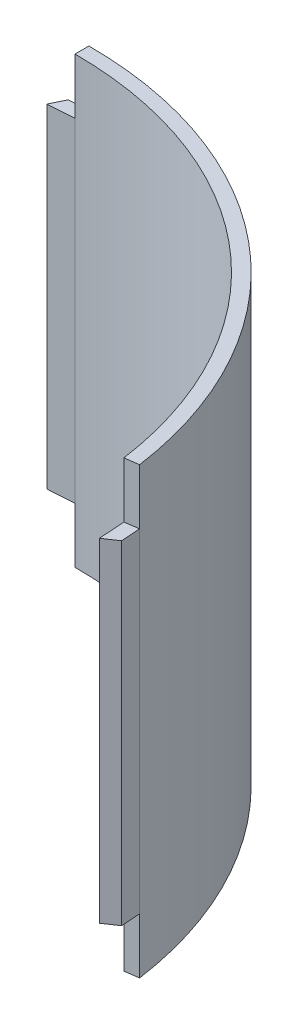
ISO-10303-21;
HEADER;
FILE_DESCRIPTION(('STEP AP214'),'2;1');
FILE_NAME('part.step','',(''),(''),'','','');
FILE_SCHEMA(('AUTOMOTIVE_DESIGN { 1 0 10303 214 1 1 1 1 }'));
ENDSEC;
DATA;
#1=APPLICATION_CONTEXT('core data for automotive mechanical design processes');
#2=APPLICATION_PROTOCOL_DEFINITION('international standard','automotive_design',2000,#1);
#3=PRODUCT_CONTEXT('',#1,'mechanical');
#4=PRODUCT('Part','Part','',(#3));
#5=PRODUCT_RELATED_PRODUCT_CATEGORY('part','',(#4));
#6=PRODUCT_DEFINITION_FORMATION('','',#4);
#7=PRODUCT_DEFINITION_CONTEXT('part definition',#1,'design');
#8=PRODUCT_DEFINITION('design','',#6,#7);
#9=PRODUCT_DEFINITION_SHAPE('','',#8);
#10=(LENGTH_UNIT() NAMED_UNIT(*) SI_UNIT(.MILLI.,.METRE.));
#11=(NAMED_UNIT(*) PLANE_ANGLE_UNIT() SI_UNIT($,.RADIAN.));
#12=(NAMED_UNIT(*) SI_UNIT($,.STERADIAN.) SOLID_ANGLE_UNIT());
#13=UNCERTAINTY_MEASURE_WITH_UNIT(LENGTH_MEASURE(1.E-05),#10,'distance_accuracy_value','');
#14=(GEOMETRIC_REPRESENTATION_CONTEXT(3) GLOBAL_UNCERTAINTY_ASSIGNED_CONTEXT((#13)) GLOBAL_UNIT_ASSIGNED_CONTEXT((#10,
#11,#12)) REPRESENTATION_CONTEXT('',''));
#15=CARTESIAN_POINT('',(0.,0.,0.));
#16=DIRECTION('',(0.,0.,1.));
#17=DIRECTION('',(1.,0.,0.));
#18=AXIS2_PLACEMENT_3D('',#15,#16,#17);
#19=CARTESIAN_POINT('',(0.,800.,-705.));
#20=DIRECTION('',(1.,0.,0.));
#21=DIRECTION('',(0.,0.,-1.));
#22=AXIS2_PLACEMENT_3D('',#19,#20,#21);
#23=PLANE('',#22);
#24=DIRECTION('',(0.,0.,-1.));
#25=VECTOR('',#24,1.);
#26=CARTESIAN_POINT('',(-1.67579190573702E-13,700.,-1.45674367899697E-13));
#27=LINE('',#26,#25);
#28=CARTESIAN_POINT('',(0.,700.,-680.));
#29=VERTEX_POINT('',#28);
#30=CARTESIAN_POINT('',(0.,700.,-705.));
#31=VERTEX_POINT('',#30);
#32=EDGE_CURVE('E144',#29,#31,#27,.T.);
#33=ORIENTED_EDGE('',*,*,#32,.F.);
#34=DIRECTION('',(0.,-1.,0.));
#35=VECTOR('',#34,1.);
#36=CARTESIAN_POINT('',(0.,800.,-680.));
#37=LINE('',#36,#35);
#38=CARTESIAN_POINT('',(0.,800.,-680.));
#39=VERTEX_POINT('',#38);
#40=EDGE_CURVE('E150',#39,#29,#37,.T.);
#41=ORIENTED_EDGE('',*,*,#40,.F.);
#42=DIRECTION('',(0.,0.,1.));
#43=VECTOR('',#42,1.);
#44=CARTESIAN_POINT('',(0.,800.,-705.));
#45=LINE('',#44,#43);
#46=CARTESIAN_POINT('',(0.,800.,-705.));
#47=VERTEX_POINT('',#46);
#48=EDGE_CURVE('E184',#47,#39,#45,.T.);
#49=ORIENTED_EDGE('',*,*,#48,.F.);
#50=DIRECTION('',(0.,-1.,0.));
#51=VECTOR('',#50,1.);
#52=CARTESIAN_POINT('',(0.,800.,-705.));
#53=LINE('',#52,#51);
#54=EDGE_CURVE('E11',#47,#31,#53,.T.);
#55=ORIENTED_EDGE('',*,*,#54,.T.);
#56=EDGE_LOOP('',(#33,#41,#49,#55));
#57=FACE_BOUND('',#56,.T.);
#58=ADVANCED_FACE('F37',(#57),#23,.F.);
#59=CARTESIAN_POINT('',(698.138988462807,800.,-98.1170361768489));
#60=DIRECTION('',(-0.139173100960069,0.,-0.99026806874157));
#61=DIRECTION('',(-0.99026806874157,0.,0.139173100960069));
#62=AXIS2_PLACEMENT_3D('',#59,#60,#61);
#63=PLANE('',#62);
#64=DIRECTION('',(0.99026806874157,0.,-0.13917310096007));
#65=VECTOR('',#64,1.);
#66=CARTESIAN_POINT('',(0.,700.,0.));
#67=LINE('',#66,#65);
#68=CARTESIAN_POINT('',(673.382286744267,700.,-94.6377086528472));
#69=VERTEX_POINT('',#68);
#70=CARTESIAN_POINT('',(698.138988462806,700.,-98.1170361768489));
#71=VERTEX_POINT('',#70);
#72=EDGE_CURVE('E225',#69,#71,#67,.T.);
#73=ORIENTED_EDGE('',*,*,#72,.T.);
#74=DIRECTION('',(0.,-1.,0.));
#75=VECTOR('',#74,1.);
#76=CARTESIAN_POINT('',(698.138988462807,800.,-98.1170361768489));
#77=LINE('',#76,#75);
#78=CARTESIAN_POINT('',(698.138988462807,800.,-98.1170361768489));
#79=VERTEX_POINT('',#78);
#80=EDGE_CURVE('E164',#79,#71,#77,.T.);
#81=ORIENTED_EDGE('',*,*,#80,.F.);
#82=DIRECTION('',(0.99026806874157,0.,-0.139173100960069));
#83=VECTOR('',#82,1.);
#84=CARTESIAN_POINT('',(698.138988462807,800.,-98.1170361768489));
#85=LINE('',#84,#83);
#86=CARTESIAN_POINT('',(673.382286744267,800.,-94.6377086528472));
#87=VERTEX_POINT('',#86);
#88=EDGE_CURVE('E181',#87,#79,#85,.T.);
#89=ORIENTED_EDGE('',*,*,#88,.F.);
#90=DIRECTION('',(0.,-1.,0.));
#91=VECTOR('',#90,1.);
#92=CARTESIAN_POINT('',(673.382286744267,800.,-94.6377086528472));
#93=LINE('',#92,#91);
#94=EDGE_CURVE('E159',#87,#69,#93,.T.);
#95=ORIENTED_EDGE('',*,*,#94,.T.);
#96=EDGE_LOOP('',(#73,#81,#89,#95));
#97=FACE_BOUND('',#96,.T.);
#98=ADVANCED_FACE('F264',(#97),#63,.F.);
#99=DIRECTION('',(0.99026806874157,0.,-0.13917310096007));
#100=VECTOR('',#99,1.);
#101=CARTESIAN_POINT('',(0.,100.,0.));
#102=LINE('',#101,#100);
#103=CARTESIAN_POINT('',(673.382286744267,100.,-94.6377086528472));
#104=VERTEX_POINT('',#103);
#105=CARTESIAN_POINT('',(698.138988462806,100.,-98.1170361768489));
#106=VERTEX_POINT('',#105);
#107=EDGE_CURVE('E60',#104,#106,#102,.T.);
#108=ORIENTED_EDGE('',*,*,#107,.F.);
#109=CARTESIAN_POINT('',(673.382286744267,0.,-94.6377086528472));
#110=VERTEX_POINT('',#109);
#111=EDGE_CURVE('E163',#104,#110,#93,.T.);
#112=ORIENTED_EDGE('',*,*,#111,.T.);
#113=DIRECTION('',(0.99026806874157,0.,-0.139173100960069));
#114=VECTOR('',#113,1.);
#115=CARTESIAN_POINT('',(698.138988462807,0.,-98.1170361768489));
#116=LINE('',#115,#114);
#117=CARTESIAN_POINT('',(698.138988462807,0.,-98.1170361768489));
#118=VERTEX_POINT('',#117);
#119=EDGE_CURVE('E168',#110,#118,#116,.T.);
#120=ORIENTED_EDGE('',*,*,#119,.T.);
#121=EDGE_CURVE('E167',#106,#118,#77,.T.);
#122=ORIENTED_EDGE('',*,*,#121,.F.);
#123=EDGE_LOOP('',(#108,#112,#120,#122));
#124=FACE_BOUND('',#123,.T.);
#125=ADVANCED_FACE('F246',(#124),#63,.F.);
#126=CARTESIAN_POINT('',(0.,800.,0.));
#127=DIRECTION('',(0.,-1.,0.));
#128=DIRECTION('',(0.,0.,-1.));
#129=AXIS2_PLACEMENT_3D('',#126,#127,#128);
#130=CYLINDRICAL_SURFACE('',#129,705.);
#131=CARTESIAN_POINT('',(0.,0.,0.));
#132=DIRECTION('',(0.,1.,0.));
#133=DIRECTION('',(0.,0.,-1.));
#134=AXIS2_PLACEMENT_3D('',#131,#132,#133);
#135=CIRCLE('',#134,705.);
#136=CARTESIAN_POINT('',(0.,0.,-705.));
#137=VERTEX_POINT('',#136);
#138=EDGE_CURVE('E177',#118,#137,#135,.T.);
#139=ORIENTED_EDGE('',*,*,#138,.T.);
#140=CARTESIAN_POINT('',(0.,100.,-705.));
#141=VERTEX_POINT('',#140);
#142=EDGE_CURVE('E45',#141,#137,#53,.T.);
#143=ORIENTED_EDGE('',*,*,#142,.F.);
#144=DIRECTION('',(0.,1.,0.));
#145=VECTOR('',#144,1.);
#146=CARTESIAN_POINT('',(2.35922392732846E-13,100.,-705.));
#147=LINE('',#146,#145);
#148=EDGE_CURVE('E204',#141,#31,#147,.T.);
#149=ORIENTED_EDGE('',*,*,#148,.T.);
#150=ORIENTED_EDGE('',*,*,#54,.F.);
#151=CARTESIAN_POINT('',(0.,800.,0.));
#152=DIRECTION('',(0.,1.,0.));
#153=DIRECTION('',(0.,0.,-1.));
#154=AXIS2_PLACEMENT_3D('',#151,#152,#153);
#155=CIRCLE('',#154,705.);
#156=EDGE_CURVE('E171',#79,#47,#155,.T.);
#157=ORIENTED_EDGE('',*,*,#156,.F.);
#158=ORIENTED_EDGE('',*,*,#80,.T.);
#159=DIRECTION('',(0.,1.,0.));
#160=VECTOR('',#159,1.);
#161=CARTESIAN_POINT('',(698.138988462806,100.,-98.1170361768489));
#162=LINE('',#161,#160);
#163=EDGE_CURVE('E180',#106,#71,#162,.T.);
#164=ORIENTED_EDGE('',*,*,#163,.F.);
#165=ORIENTED_EDGE('',*,*,#121,.T.);
#166=EDGE_LOOP('',(#139,#143,#149,#150,#157,#158,#164,#165));
#167=FACE_BOUND('',#166,.T.);
#168=ADVANCED_FACE('F39',(#167),#130,.T.);
#169=CARTESIAN_POINT('',(1.94289029309402E-13,100.,-680.));
#170=VERTEX_POINT('',#169);
#171=CARTESIAN_POINT('',(0.,0.,-680.));
#172=VERTEX_POINT('',#171);
#173=EDGE_CURVE('E158',#170,#172,#37,.T.);
#174=ORIENTED_EDGE('',*,*,#173,.F.);
#175=DIRECTION('',(0.,0.,-1.));
#176=VECTOR('',#175,1.);
#177=CARTESIAN_POINT('',(0.,100.,0.));
#178=LINE('',#177,#176);
#179=EDGE_CURVE('E213',#170,#141,#178,.T.);
#180=ORIENTED_EDGE('',*,*,#179,.T.);
#181=ORIENTED_EDGE('',*,*,#142,.T.);
#182=DIRECTION('',(0.,0.,1.));
#183=VECTOR('',#182,1.);
#184=CARTESIAN_POINT('',(0.,0.,-705.));
#185=LINE('',#184,#183);
#186=EDGE_CURVE('E174',#137,#172,#185,.T.);
#187=ORIENTED_EDGE('',*,*,#186,.T.);
#188=EDGE_LOOP('',(#174,#180,#181,#187));
#189=FACE_BOUND('',#188,.T.);
#190=ADVANCED_FACE('F238',(#189),#23,.F.);
#191=CARTESIAN_POINT('',(0.,800.,0.));
#192=DIRECTION('',(0.,-1.,0.));
#193=DIRECTION('',(0.,0.,-1.));
#194=AXIS2_PLACEMENT_3D('',#191,#192,#193);
#195=CYLINDRICAL_SURFACE('',#194,680.);
#196=CARTESIAN_POINT('',(0.,0.,0.));
#197=DIRECTION('',(0.,-1.,0.));
#198=DIRECTION('',(0.,0.,-1.));
#199=AXIS2_PLACEMENT_3D('',#196,#197,#198);
#200=CIRCLE('',#199,680.);
#201=EDGE_CURVE('E172',#172,#110,#200,.T.);
#202=ORIENTED_EDGE('',*,*,#201,.T.);
#203=ORIENTED_EDGE('',*,*,#111,.F.);
#204=DIRECTION('',(0.,1.,0.));
#205=VECTOR('',#204,1.);
#206=CARTESIAN_POINT('',(673.382286744267,100.,-94.6377086528472));
#207=LINE('',#206,#205);
#208=EDGE_CURVE('E188',#104,#69,#207,.T.);
#209=ORIENTED_EDGE('',*,*,#208,.T.);
#210=ORIENTED_EDGE('',*,*,#94,.F.);
#211=CARTESIAN_POINT('',(0.,800.,0.));
#212=DIRECTION('',(0.,-1.,0.));
#213=DIRECTION('',(0.,0.,-1.));
#214=AXIS2_PLACEMENT_3D('',#211,#212,#213);
#215=CIRCLE('',#214,680.);
#216=EDGE_CURVE('E157',#39,#87,#215,.T.);
#217=ORIENTED_EDGE('',*,*,#216,.F.);
#218=ORIENTED_EDGE('',*,*,#40,.T.);
#219=DIRECTION('',(0.,1.,0.));
#220=VECTOR('',#219,1.);
#221=CARTESIAN_POINT('',(1.94289029309402E-13,100.,-680.));
#222=LINE('',#221,#220);
#223=EDGE_CURVE('E128',#170,#29,#222,.T.);
#224=ORIENTED_EDGE('',*,*,#223,.F.);
#225=ORIENTED_EDGE('',*,*,#173,.T.);
#226=EDGE_LOOP('',(#202,#203,#209,#210,#217,#218,#224,#225));
#227=FACE_BOUND('',#226,.T.);
#228=ADVANCED_FACE('F155',(#227),#195,.F.);
#229=CARTESIAN_POINT('',(0.,800.,0.));
#230=DIRECTION('',(0.,-1.,0.));
#231=DIRECTION('',(0.,0.,-1.));
#232=AXIS2_PLACEMENT_3D('',#229,#230,#231);
#233=PLANE('',#232);
#234=ORIENTED_EDGE('',*,*,#156,.T.);
#235=ORIENTED_EDGE('',*,*,#48,.T.);
#236=ORIENTED_EDGE('',*,*,#216,.T.);
#237=ORIENTED_EDGE('',*,*,#88,.T.);
#238=EDGE_LOOP('',(#234,#235,#236,#237));
#239=FACE_BOUND('',#238,.T.);
#240=ADVANCED_FACE('F267',(#239),#233,.F.);
#241=CARTESIAN_POINT('',(0.,0.,0.));
#242=DIRECTION('',(0.,-1.,0.));
#243=DIRECTION('',(0.,0.,-1.));
#244=AXIS2_PLACEMENT_3D('',#241,#242,#243);
#245=PLANE('',#244);
#246=ORIENTED_EDGE('',*,*,#138,.F.);
#247=ORIENTED_EDGE('',*,*,#119,.F.);
#248=ORIENTED_EDGE('',*,*,#201,.F.);
#249=ORIENTED_EDGE('',*,*,#186,.F.);
#250=EDGE_LOOP('',(#246,#247,#248,#249));
#251=FACE_BOUND('',#250,.T.);
#252=ADVANCED_FACE('F245',(#251),#245,.T.);
#253=CARTESIAN_POINT('',(701.569494231403,100.,-49.0585180884084));
#254=DIRECTION('',(-0.997564050259826,0.,0.0697564737441046));
#255=DIRECTION('',(0.0697564737441046,0.,0.997564050259826));
#256=AXIS2_PLACEMENT_3D('',#253,#254,#255);
#257=PLANE('',#256);
#258=ORIENTED_EDGE('',*,*,#163,.T.);
#259=DIRECTION('',(0.0697564737441046,0.,0.997564050259826));
#260=VECTOR('',#259,1.);
#261=CARTESIAN_POINT('',(701.569494231403,700.,-49.0585180884084));
#262=LINE('',#261,#260);
#263=CARTESIAN_POINT('',(700.565098890112,700.,-63.4220406540098));
#264=VERTEX_POINT('',#263);
#265=EDGE_CURVE('E222',#71,#264,#262,.T.);
#266=ORIENTED_EDGE('',*,*,#265,.T.);
#267=DIRECTION('',(0.,1.,0.));
#268=VECTOR('',#267,1.);
#269=CARTESIAN_POINT('',(700.565098890112,100.,-63.4220406540098));
#270=LINE('',#269,#268);
#271=CARTESIAN_POINT('',(700.565098890112,100.,-63.4220406540098));
#272=VERTEX_POINT('',#271);
#273=EDGE_CURVE('E193',#272,#264,#270,.T.);
#274=ORIENTED_EDGE('',*,*,#273,.F.);
#275=DIRECTION('',(0.0697564737441046,0.,0.997564050259826));
#276=VECTOR('',#275,1.);
#277=CARTESIAN_POINT('',(701.569494231403,100.,-49.0585180884084));
#278=LINE('',#277,#276);
#279=EDGE_CURVE('E191',#106,#272,#278,.T.);
#280=ORIENTED_EDGE('',*,*,#279,.F.);
#281=EDGE_LOOP('',(#258,#266,#274,#280));
#282=FACE_BOUND('',#281,.T.);
#283=ADVANCED_FACE('F251',(#282),#257,.F.);
#284=CARTESIAN_POINT('',(189.662450805355,100.,281.186146756497));
#285=DIRECTION('',(0.559192903470734,0.,0.82903757255505));
#286=DIRECTION('',(0.82903757255505,0.,-0.559192903470734));
#287=AXIS2_PLACEMENT_3D('',#284,#285,#286);
#288=PLANE('',#287);
#289=ORIENTED_EDGE('',*,*,#273,.T.);
#290=DIRECTION('',(0.82903757255505,0.,-0.559192903470734));
#291=VECTOR('',#290,1.);
#292=CARTESIAN_POINT('',(189.662450805355,700.,281.186146756497));
#293=LINE('',#292,#291);
#294=CARTESIAN_POINT('',(676.691143372133,700.,-47.3188543264161));
#295=VERTEX_POINT('',#294);
#296=EDGE_CURVE('E219',#295,#264,#293,.T.);
#297=ORIENTED_EDGE('',*,*,#296,.F.);
#298=DIRECTION('',(0.,1.,0.));
#299=VECTOR('',#298,1.);
#300=CARTESIAN_POINT('',(676.691143372133,100.,-47.3188543264161));
#301=LINE('',#300,#299);
#302=CARTESIAN_POINT('',(676.691143372133,100.,-47.3188543264161));
#303=VERTEX_POINT('',#302);
#304=EDGE_CURVE('E190',#303,#295,#301,.T.);
#305=ORIENTED_EDGE('',*,*,#304,.F.);
#306=DIRECTION('',(0.82903757255505,0.,-0.559192903470734));
#307=VECTOR('',#306,1.);
#308=CARTESIAN_POINT('',(189.662450805355,100.,281.186146756497));
#309=LINE('',#308,#307);
#310=EDGE_CURVE('E197',#303,#272,#309,.T.);
#311=ORIENTED_EDGE('',*,*,#310,.T.);
#312=EDGE_LOOP('',(#289,#297,#305,#311));
#313=FACE_BOUND('',#312,.T.);
#314=ADVANCED_FACE('F304',(#313),#288,.T.);
#315=CARTESIAN_POINT('',(676.691143372134,100.,-47.3188543264082));
#316=DIRECTION('',(-0.997564050259826,0.,0.0697564737441047));
#317=DIRECTION('',(0.0697564737441047,0.,0.997564050259826));
#318=AXIS2_PLACEMENT_3D('',#315,#316,#317);
#319=PLANE('',#318);
#320=ORIENTED_EDGE('',*,*,#304,.T.);
#321=DIRECTION('',(0.0697564737441047,0.,0.997564050259826));
#322=VECTOR('',#321,1.);
#323=CARTESIAN_POINT('',(676.691143372134,700.,-47.3188543264082));
#324=LINE('',#323,#322);
#325=EDGE_CURVE('E216',#69,#295,#324,.T.);
#326=ORIENTED_EDGE('',*,*,#325,.F.);
#327=ORIENTED_EDGE('',*,*,#208,.F.);
#328=DIRECTION('',(0.0697564737441047,0.,0.997564050259826));
#329=VECTOR('',#328,1.);
#330=CARTESIAN_POINT('',(676.691143372134,100.,-47.3188543264082));
#331=LINE('',#330,#329);
#332=EDGE_CURVE('E200',#104,#303,#331,.T.);
#333=ORIENTED_EDGE('',*,*,#332,.T.);
#334=EDGE_LOOP('',(#320,#326,#327,#333));
#335=FACE_BOUND('',#334,.T.);
#336=ADVANCED_FACE('F258',(#335),#319,.T.);
#337=CARTESIAN_POINT('',(0.,100.,0.));
#338=DIRECTION('',(0.,1.,0.));
#339=DIRECTION('',(0.,0.,1.));
#340=AXIS2_PLACEMENT_3D('',#337,#338,#339);
#341=PLANE('',#340);
#342=ORIENTED_EDGE('',*,*,#107,.T.);
#343=ORIENTED_EDGE('',*,*,#279,.T.);
#344=ORIENTED_EDGE('',*,*,#310,.F.);
#345=ORIENTED_EDGE('',*,*,#332,.F.);
#346=EDGE_LOOP('',(#342,#343,#344,#345));
#347=FACE_BOUND('',#346,.T.);
#348=ADVANCED_FACE('F256',(#347),#341,.F.);
#349=CARTESIAN_POINT('',(-47.3188543264387,100.,-676.691143372131));
#350=DIRECTION('',(-0.069756473744149,0.,-0.997564050259823));
#351=DIRECTION('',(-0.997564050259823,0.,0.0697564737441491));
#352=AXIS2_PLACEMENT_3D('',#349,#350,#351);
#353=PLANE('',#352);
#354=DIRECTION('',(-0.997564050259823,0.,0.0697564737441491));
#355=VECTOR('',#354,1.);
#356=CARTESIAN_POINT('',(-47.3188543264388,700.,-676.691143372132));
#357=LINE('',#356,#355);
#358=CARTESIAN_POINT('',(-47.3188543264309,700.,-676.691143372132));
#359=VERTEX_POINT('',#358);
#360=EDGE_CURVE('E132',#29,#359,#357,.T.);
#361=ORIENTED_EDGE('',*,*,#360,.T.);
#362=DIRECTION('',(0.,1.,0.));
#363=VECTOR('',#362,1.);
#364=CARTESIAN_POINT('',(-47.3188543264308,100.,-676.691143372132));
#365=LINE('',#364,#363);
#366=CARTESIAN_POINT('',(-47.3188543264308,100.,-676.691143372132));
#367=VERTEX_POINT('',#366);
#368=EDGE_CURVE('E136',#367,#359,#365,.T.);
#369=ORIENTED_EDGE('',*,*,#368,.F.);
#370=DIRECTION('',(-0.997564050259823,0.,0.0697564737441491));
#371=VECTOR('',#370,1.);
#372=CARTESIAN_POINT('',(-47.3188543264387,100.,-676.691143372131));
#373=LINE('',#372,#371);
#374=EDGE_CURVE('E133',#170,#367,#373,.T.);
#375=ORIENTED_EDGE('',*,*,#374,.F.);
#376=ORIENTED_EDGE('',*,*,#223,.T.);
#377=EDGE_LOOP('',(#361,#369,#375,#376));
#378=FACE_BOUND('',#377,.T.);
#379=ADVANCED_FACE('F130',(#378),#353,.F.);
#380=CARTESIAN_POINT('',(-304.845573919707,100.,-148.683120880698));
#381=DIRECTION('',(0.898794046299175,0.,0.438371146789061));
#382=DIRECTION('',(0.438371146789061,0.,-0.898794046299175));
#383=AXIS2_PLACEMENT_3D('',#380,#381,#382);
#384=PLANE('',#383);
#385=DIRECTION('',(0.43837114678906,0.,-0.898794046299175));
#386=VECTOR('',#385,1.);
#387=CARTESIAN_POINT('',(-304.845573919708,700.,-148.683120880698));
#388=LINE('',#387,#386);
#389=CARTESIAN_POINT('',(-34.694995522839,700.,-702.573889572692));
#390=VERTEX_POINT('',#389);
#391=EDGE_CURVE('E146',#359,#390,#388,.T.);
#392=ORIENTED_EDGE('',*,*,#391,.T.);
#393=DIRECTION('',(0.,1.,0.));
#394=VECTOR('',#393,1.);
#395=CARTESIAN_POINT('',(-34.6949955228388,100.,-702.573889572692));
#396=LINE('',#395,#394);
#397=CARTESIAN_POINT('',(-34.6949955228388,100.,-702.573889572692));
#398=VERTEX_POINT('',#397);
#399=EDGE_CURVE('E206',#398,#390,#396,.T.);
#400=ORIENTED_EDGE('',*,*,#399,.F.);
#401=DIRECTION('',(0.43837114678906,0.,-0.898794046299175));
#402=VECTOR('',#401,1.);
#403=CARTESIAN_POINT('',(-304.845573919707,100.,-148.683120880698));
#404=LINE('',#403,#402);
#405=EDGE_CURVE('E210',#367,#398,#404,.T.);
#406=ORIENTED_EDGE('',*,*,#405,.F.);
#407=ORIENTED_EDGE('',*,*,#368,.T.);
#408=EDGE_LOOP('',(#392,#400,#406,#407));
#409=FACE_BOUND('',#408,.T.);
#410=ADVANCED_FACE('F232',(#409),#384,.F.);
#411=CARTESIAN_POINT('',(-49.0585180884402,100.,-701.569494231401));
#412=DIRECTION('',(-0.0697564737441492,0.,-0.997564050259823));
#413=DIRECTION('',(-0.997564050259823,0.,0.0697564737441492));
#414=AXIS2_PLACEMENT_3D('',#411,#412,#413);
#415=PLANE('',#414);
#416=DIRECTION('',(-0.997564050259823,0.,0.0697564737441492));
#417=VECTOR('',#416,1.);
#418=CARTESIAN_POINT('',(-49.0585180884403,700.,-701.569494231401));
#419=LINE('',#418,#417);
#420=EDGE_CURVE('E228',#31,#390,#419,.T.);
#421=ORIENTED_EDGE('',*,*,#420,.F.);
#422=ORIENTED_EDGE('',*,*,#148,.F.);
#423=DIRECTION('',(-0.997564050259823,0.,0.0697564737441492));
#424=VECTOR('',#423,1.);
#425=CARTESIAN_POINT('',(-49.0585180884402,100.,-701.569494231401));
#426=LINE('',#425,#424);
#427=EDGE_CURVE('E52',#141,#398,#426,.T.);
#428=ORIENTED_EDGE('',*,*,#427,.T.);
#429=ORIENTED_EDGE('',*,*,#399,.T.);
#430=EDGE_LOOP('',(#421,#422,#428,#429));
#431=FACE_BOUND('',#430,.T.);
#432=ADVANCED_FACE('F270',(#431),#415,.T.);
#433=CARTESIAN_POINT('',(0.,100.,0.));
#434=DIRECTION('',(0.,1.,0.));
#435=DIRECTION('',(-0.99026806874157,0.,0.139173100960069));
#436=AXIS2_PLACEMENT_3D('',#433,#434,#435);
#437=PLANE('',#436);
#438=ORIENTED_EDGE('',*,*,#179,.F.);
#439=ORIENTED_EDGE('',*,*,#374,.T.);
#440=ORIENTED_EDGE('',*,*,#405,.T.);
#441=ORIENTED_EDGE('',*,*,#427,.F.);
#442=EDGE_LOOP('',(#438,#439,#440,#441));
#443=FACE_BOUND('',#442,.T.);
#444=ADVANCED_FACE('F234',(#443),#437,.F.);
#445=CARTESIAN_POINT('',(0.,700.,0.));
#446=DIRECTION('',(0.,-1.,0.));
#447=DIRECTION('',(0.,0.,1.));
#448=AXIS2_PLACEMENT_3D('',#445,#446,#447);
#449=PLANE('',#448);
#450=ORIENTED_EDGE('',*,*,#72,.F.);
#451=ORIENTED_EDGE('',*,*,#325,.T.);
#452=ORIENTED_EDGE('',*,*,#296,.T.);
#453=ORIENTED_EDGE('',*,*,#265,.F.);
#454=EDGE_LOOP('',(#450,#451,#452,#453));
#455=FACE_BOUND('',#454,.T.);
#456=ADVANCED_FACE('F277',(#455),#449,.F.);
#457=CARTESIAN_POINT('',(-1.67579190573702E-13,700.,-1.45674367899697E-13));
#458=DIRECTION('',(0.,-1.,0.));
#459=DIRECTION('',(-0.99026806874157,0.,0.139173100960069));
#460=AXIS2_PLACEMENT_3D('',#457,#458,#459);
#461=PLANE('',#460);
#462=ORIENTED_EDGE('',*,*,#32,.T.);
#463=ORIENTED_EDGE('',*,*,#420,.T.);
#464=ORIENTED_EDGE('',*,*,#391,.F.);
#465=ORIENTED_EDGE('',*,*,#360,.F.);
#466=EDGE_LOOP('',(#462,#463,#464,#465));
#467=FACE_BOUND('',#466,.T.);
#468=ADVANCED_FACE('F142',(#467),#461,.F.);
#469=CLOSED_SHELL('',(#58,#98,#125,#168,#190,#228,#240,#252,#283,#314,#336,#348,#379,#410,#432,
#444,#456,#468));
#470=MANIFOLD_SOLID_BREP('B2',#469);
#471=ADVANCED_BREP_SHAPE_REPRESENTATION('',(#18,#470),#14);
#472=SHAPE_DEFINITION_REPRESENTATION(#9,#471);
ENDSEC;
END-ISO-10303-21;
